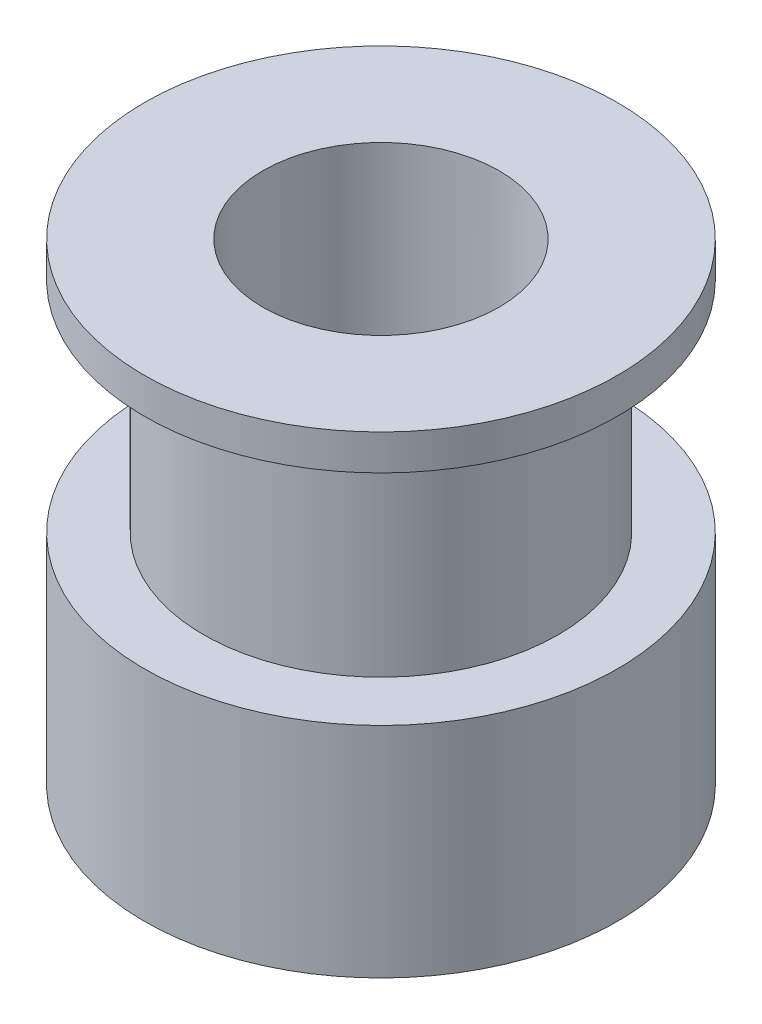
ISO-10303-21;
HEADER;
FILE_DESCRIPTION(('STEP AP214'),'2;1');
FILE_NAME('part.step','',(''),(''),'','','');
FILE_SCHEMA(('AUTOMOTIVE_DESIGN { 1 0 10303 214 1 1 1 1 }'));
ENDSEC;
DATA;
#1=APPLICATION_CONTEXT('core data for automotive mechanical design processes');
#2=APPLICATION_PROTOCOL_DEFINITION('international standard','automotive_design',2000,#1);
#3=PRODUCT_CONTEXT('',#1,'mechanical');
#4=PRODUCT('Part','Part','',(#3));
#5=PRODUCT_RELATED_PRODUCT_CATEGORY('part','',(#4));
#6=PRODUCT_DEFINITION_FORMATION('','',#4);
#7=PRODUCT_DEFINITION_CONTEXT('part definition',#1,'design');
#8=PRODUCT_DEFINITION('design','',#6,#7);
#9=PRODUCT_DEFINITION_SHAPE('','',#8);
#10=(LENGTH_UNIT() NAMED_UNIT(*) SI_UNIT(.MILLI.,.METRE.));
#11=(NAMED_UNIT(*) PLANE_ANGLE_UNIT() SI_UNIT($,.RADIAN.));
#12=(NAMED_UNIT(*) SI_UNIT($,.STERADIAN.) SOLID_ANGLE_UNIT());
#13=UNCERTAINTY_MEASURE_WITH_UNIT(LENGTH_MEASURE(1.E-05),#10,'distance_accuracy_value','');
#14=(GEOMETRIC_REPRESENTATION_CONTEXT(3) GLOBAL_UNCERTAINTY_ASSIGNED_CONTEXT((#13)) GLOBAL_UNIT_ASSIGNED_CONTEXT((#10,
#11,#12)) REPRESENTATION_CONTEXT('',''));
#15=CARTESIAN_POINT('',(0.,0.,0.));
#16=DIRECTION('',(0.,0.,1.));
#17=DIRECTION('',(1.,0.,0.));
#18=AXIS2_PLACEMENT_3D('',#15,#16,#17);
#19=CARTESIAN_POINT('',(0.,-11.,0.));
#20=DIRECTION('',(0.,-1.,0.));
#21=DIRECTION('',(1.,0.,0.));
#22=AXIS2_PLACEMENT_3D('',#19,#20,#21);
#23=PLANE('',#22);
#24=CARTESIAN_POINT('',(0.,-11.,0.));
#25=DIRECTION('',(0.,-1.,0.));
#26=DIRECTION('',(1.,0.,0.));
#27=AXIS2_PLACEMENT_3D('',#24,#25,#26);
#28=CIRCLE('',#27,4.);
#29=CARTESIAN_POINT('',(4.,-11.,0.));
#30=VERTEX_POINT('',#29);
#31=EDGE_CURVE('E69',#30,#30,#28,.F.);
#32=ORIENTED_EDGE('',*,*,#31,.T.);
#33=EDGE_LOOP('',(#32));
#34=FACE_BOUND('',#33,.T.);
#35=CARTESIAN_POINT('',(0.,-10.9999999999999,0.));
#36=DIRECTION('',(0.,1.,0.));
#37=DIRECTION('',(-1.,0.,0.));
#38=AXIS2_PLACEMENT_3D('',#35,#36,#37);
#39=CIRCLE('',#38,8.);
#40=CARTESIAN_POINT('',(-8.,-10.9999999999999,0.));
#41=VERTEX_POINT('',#40);
#42=EDGE_CURVE('E10',#41,#41,#39,.T.);
#43=ORIENTED_EDGE('',*,*,#42,.F.);
#44=EDGE_LOOP('',(#43));
#45=FACE_BOUND('',#44,.T.);
#46=ADVANCED_FACE('F37',(#34,#45),#23,.T.);
#47=CARTESIAN_POINT('',(0.,1004.77636363636,0.));
#48=DIRECTION('',(0.,1.,0.));
#49=DIRECTION('',(-1.,0.,0.));
#50=AXIS2_PLACEMENT_3D('',#47,#48,#49);
#51=CYLINDRICAL_SURFACE('',#50,8.);
#52=CARTESIAN_POINT('',(-7.74596669241484,-7.30000000000005,-1.99999999999997));
#53=CARTESIAN_POINT('',(-7.74596880070288,-7.18955939925879,-1.99999686287443));
#54=CARTESIAN_POINT('',(-7.74835444811678,-7.07908408105723,-1.99082099639809));
#55=CARTESIAN_POINT('',(-7.75761489594052,-6.86130593746124,-1.95441850037101));
#56=CARTESIAN_POINT('',(-7.76449230897305,-6.7540049964255,-1.92718136539366));
#57=CARTESIAN_POINT('',(-7.78190979676921,-6.5457571694503,-1.85559295970561));
#58=CARTESIAN_POINT('',(-7.79244514152367,-6.44480227569148,-1.81126378228357));
#59=CARTESIAN_POINT('',(-7.81598553623007,-6.25175131796814,-1.70681691300908));
#60=CARTESIAN_POINT('',(-7.82899069102792,-6.15965563033588,-1.64669855084852));
#61=CARTESIAN_POINT('',(-7.856325730845,-5.98491068379028,-1.51096674184948));
#62=CARTESIAN_POINT('',(-7.87067678098427,-5.90248511972001,-1.43506951016321));
#63=CARTESIAN_POINT('',(-7.89890300412235,-5.75139088451178,-1.2705456512805));
#64=CARTESIAN_POINT('',(-7.91277813253111,-5.68272349950265,-1.18191783534422));
#65=CARTESIAN_POINT('',(-7.93872332416466,-5.56017962589503,-0.992916160863138));
#66=CARTESIAN_POINT('',(-7.95076549920474,-5.50652288947088,-0.89239566095607));
#67=CARTESIAN_POINT('',(-7.97144649540787,-5.41695228467758,-0.683410547434183));
#68=CARTESIAN_POINT('',(-7.98008581867475,-5.38103579846764,-0.574947108633526));
#69=CARTESIAN_POINT('',(-7.99283807078544,-5.32868173233718,-0.355487007003302));
#70=CARTESIAN_POINT('',(-7.99703915075451,-5.31186428453878,-0.244586175639154));
#71=CARTESIAN_POINT('',(-8.00074875285838,-5.2969932965796,-0.0214630554101889));
#72=CARTESIAN_POINT('',(-8.00025796877363,-5.29893698223237,0.0907590356304813));
#73=CARTESIAN_POINT('',(-7.99470475962827,-5.32125988020016,0.310704494344801));
#74=CARTESIAN_POINT('',(-7.98974401872699,-5.34122906004313,0.41847243120216));
#75=CARTESIAN_POINT('',(-7.97592669219883,-5.39837701603885,0.629076494827399));
#76=CARTESIAN_POINT('',(-7.96706989918752,-5.43555670830197,0.731912358740902));
#77=CARTESIAN_POINT('',(-7.94630007760716,-5.5264020565497,0.930813407003639));
#78=CARTESIAN_POINT('',(-7.93436015756042,-5.58021363572944,1.02680901953303));
#79=CARTESIAN_POINT('',(-7.90871923047719,-5.70268454329305,1.208551244681));
#80=CARTESIAN_POINT('',(-7.89501791721991,-5.77134645484854,1.29429607017104));
#81=CARTESIAN_POINT('',(-7.86690971015616,-5.92376699358595,1.45554807016994));
#82=CARTESIAN_POINT('',(-7.85249375620733,-6.00788391387827,1.53071535815042));
#83=CARTESIAN_POINT('',(-7.82492034813364,-6.18767997883225,1.66595275192606));
#84=CARTESIAN_POINT('',(-7.81176295284776,-6.28335966359285,1.72602215209206));
#85=CARTESIAN_POINT('',(-7.78816397465318,-6.48423202731922,1.82957625804522));
#86=CARTESIAN_POINT('',(-7.77773586980576,-6.5894685842506,1.87297913394101));
#87=CARTESIAN_POINT('',(-7.76094912111965,-6.80606837446121,1.94137124127271));
#88=CARTESIAN_POINT('',(-7.75458960648174,-6.91743029118656,1.96636441310585));
#89=CARTESIAN_POINT('',(-7.74684284831312,-7.13996760121854,1.99666371093217));
#90=CARTESIAN_POINT('',(-7.74532871274918,-7.25107023466375,2.00247237913573));
#91=CARTESIAN_POINT('',(-7.74709874784831,-7.47265754926257,1.99561359241246));
#92=CARTESIAN_POINT('',(-7.75038247681012,-7.58314228636104,1.98294783827907));
#93=CARTESIAN_POINT('',(-7.76125665563648,-7.79849141196381,1.93994037115016));
#94=CARTESIAN_POINT('',(-7.76877576187499,-7.90341818125672,1.90989125462542));
#95=CARTESIAN_POINT('',(-7.78720574616769,-8.10674516628139,1.83329446533652));
#96=CARTESIAN_POINT('',(-7.7981170259889,-8.20514460724432,1.78674483817006));
#97=CARTESIAN_POINT('',(-7.82236909674609,-8.39475302229393,1.67741653434927));
#98=CARTESIAN_POINT('',(-7.83575334885313,-8.48578307203453,1.61433740306853));
#99=CARTESIAN_POINT('',(-7.86333666457372,-8.65615069024113,1.47412058586894));
#100=CARTESIAN_POINT('',(-7.87753586182776,-8.73548633332011,1.39698058961091));
#101=CARTESIAN_POINT('',(-7.90557922425284,-8.88224883405681,1.22852544196948));
#102=CARTESIAN_POINT('',(-7.91940561649468,-8.9493280500391,1.13690390506321));
#103=CARTESIAN_POINT('',(-7.94477773290987,-9.06714869356104,0.943405365389378));
#104=CARTESIAN_POINT('',(-7.95632357603168,-9.11789097328661,0.841528897915209));
#105=CARTESIAN_POINT('',(-7.9757609259065,-9.20115682762239,0.631116403462208));
#106=CARTESIAN_POINT('',(-7.98367864017924,-9.2338114275033,0.522634762055791));
#107=CARTESIAN_POINT('',(-7.99508234716633,-9.28036826768678,0.301499520637641));
#108=CARTESIAN_POINT('',(-7.99856919514738,-9.29427412699128,0.188846730082509));
#109=CARTESIAN_POINT('',(-8.00068338817611,-9.30273517915112,-0.0341670528866179));
#110=CARTESIAN_POINT('',(-7.99943957759977,-9.29780341819086,-0.144507653932015));
#111=CARTESIAN_POINT('',(-7.99251792914887,-9.26990434541135,-0.362734992829473));
#112=CARTESIAN_POINT('',(-7.98684022314338,-9.24693756997371,-0.470621803561829));
#113=CARTESIAN_POINT('',(-7.97170865707778,-9.18389556045832,-0.680342071289521));
#114=CARTESIAN_POINT('',(-7.96227529004785,-9.14391309337129,-0.782204989161699));
#115=CARTESIAN_POINT('',(-7.94062577827316,-9.0480588419609,-0.977834106083221));
#116=CARTESIAN_POINT('',(-7.92840928277515,-8.99218505465908,-1.07159928253124));
#117=CARTESIAN_POINT('',(-7.90214499360574,-8.86456953200778,-1.25080385684658));
#118=CARTESIAN_POINT('',(-7.88806033883329,-8.79247971419239,-1.33598997659664));
#119=CARTESIAN_POINT('',(-7.8598129811438,-8.63515429604535,-1.49323004054698));
#120=CARTESIAN_POINT('',(-7.84565025934605,-8.54991536777772,-1.56528065015315));
#121=CARTESIAN_POINT('',(-7.81854951691005,-8.36679717162113,-1.69552405294364));
#122=CARTESIAN_POINT('',(-7.80563927346578,-8.26871175326954,-1.75343323883273));
#123=CARTESIAN_POINT('',(-7.78287910989656,-8.06388902025041,-1.85185379317091));
#124=CARTESIAN_POINT('',(-7.77302696466428,-7.95715806781236,-1.89237781950428));
#125=CARTESIAN_POINT('',(-7.75903817501475,-7.75884597632973,-1.94884505714198));
#126=CARTESIAN_POINT('',(-7.75417326006998,-7.66821367122777,-1.96798634119373));
#127=CARTESIAN_POINT('',(-7.74763677165241,-7.48506226200467,-1.99356458514351));
#128=CARTESIAN_POINT('',(-7.74596492578216,-7.39254331951124,-2.00000262874347));
#129=CARTESIAN_POINT('',(-7.74596669241484,-7.30000000000005,-1.99999999999997));
#130=B_SPLINE_CURVE_WITH_KNOTS('',3,(#52,#53,#54,#55,#56,#57,#58,#59,#60,#61,#62,#63,#64,#65,
#66,#67,#68,#69,#70,#71,#72,#73,#74,#75,#76,#77,#78,#79,#80,#81,#82,#83,#84,#85,#86,#87,#88,#89,
#90,#91,#92,#93,#94,#95,#96,#97,#98,#99,#100,#101,#102,#103,#104,#105,#106,#107,#108,#109,#110,
#111,#112,#113,#114,#115,#116,#117,#118,#119,#120,#121,#122,#123,#124,#125,#126,#127,#128,#129),
.UNSPECIFIED.,.T.,.F.,(4,2,2,2,2,2,2,2,2,2,2,2,2,2,2,2,2,2,2,2,2,2,2,2,2,2,2,2,2,2,2,2,2,2,2,2,
2,2,4),(0.,0.33098195338891,0.662156593142933,0.992904581732815,1.32366661404383,
1.66099163354381,1.99834817183893,2.34041197118336,2.68242527877674,3.01751000796277,
3.35254518932816,3.68014610151158,4.00776445379829,4.33834299403556,4.66897908375131,
5.00856373257529,5.34816424959842,5.68941145606722,6.03058560103638,6.36274859809374,
6.69488101747042,7.02157924007366,7.34831617137134,7.68146276687326,8.01466415108036,
8.35620264772255,8.69772332575643,9.03673658245543,9.3756843912723,9.70546756901965,
10.0352409390158,10.3632390124777,10.6912784459046,11.0271767726566,11.3631602525241,
11.7054118182895,12.0474137709606,12.3247826174462,12.6021278008238),.UNSPECIFIED.);
#131=CARTESIAN_POINT('',(-7.74596669241484,-7.30000000000005,-1.99999999999997));
#132=VERTEX_POINT('',#131);
#133=EDGE_CURVE('E110',#132,#132,#130,.T.);
#134=ORIENTED_EDGE('',*,*,#133,.T.);
#135=EDGE_LOOP('',(#134));
#136=FACE_BOUND('',#135,.T.);
#137=CARTESIAN_POINT('',(2.,-7.30000000000005,-7.74596669241483));
#138=CARTESIAN_POINT('',(1.99999686287446,-7.18955939925879,-7.74596880070288));
#139=CARTESIAN_POINT('',(1.99082099639812,-7.07908408105723,-7.74835444811678));
#140=CARTESIAN_POINT('',(1.95441850037104,-6.86130593746124,-7.75761489594051));
#141=CARTESIAN_POINT('',(1.92718136539368,-6.7540049964255,-7.76449230897304));
#142=CARTESIAN_POINT('',(1.85559295970563,-6.5457571694503,-7.7819097967692));
#143=CARTESIAN_POINT('',(1.81126378228359,-6.44480227569148,-7.79244514152366));
#144=CARTESIAN_POINT('',(1.70681691300911,-6.25175131796814,-7.81598553623007));
#145=CARTESIAN_POINT('',(1.64669855084855,-6.15965563033587,-7.82899069102791));
#146=CARTESIAN_POINT('',(1.51096674184951,-5.98491068379028,-7.856325730845));
#147=CARTESIAN_POINT('',(1.43506951016324,-5.90248511972001,-7.87067678098427));
#148=CARTESIAN_POINT('',(1.27054565128053,-5.75139088451178,-7.89890300412235));
#149=CARTESIAN_POINT('',(1.18191783534425,-5.68272349950265,-7.9127781325311));
#150=CARTESIAN_POINT('',(0.992916160863165,-5.56017962589503,-7.93872332416466));
#151=CARTESIAN_POINT('',(0.892395660956098,-5.50652288947088,-7.95076549920474));
#152=CARTESIAN_POINT('',(0.683410547434211,-5.41695228467758,-7.97144649540787));
#153=CARTESIAN_POINT('',(0.574947108633553,-5.38103579846764,-7.98008581867475));
#154=CARTESIAN_POINT('',(0.35548700700333,-5.32868173233718,-7.99283807078544));
#155=CARTESIAN_POINT('',(0.244586175639181,-5.31186428453878,-7.99703915075451));
#156=CARTESIAN_POINT('',(0.0214630554102163,-5.2969932965796,-8.00074875285838));
#157=CARTESIAN_POINT('',(-0.0907590356304541,-5.29893698223237,-8.00025796877363));
#158=CARTESIAN_POINT('',(-0.310704494344774,-5.32125988020016,-7.99470475962828));
#159=CARTESIAN_POINT('',(-0.418472431202133,-5.34122906004313,-7.98974401872699));
#160=CARTESIAN_POINT('',(-0.629076494827372,-5.39837701603885,-7.97592669219883));
#161=CARTESIAN_POINT('',(-0.731912358740875,-5.43555670830198,-7.96706989918752));
#162=CARTESIAN_POINT('',(-0.930813407003612,-5.5264020565497,-7.94630007760716));
#163=CARTESIAN_POINT('',(-1.02680901953301,-5.58021363572945,-7.93436015756043));
#164=CARTESIAN_POINT('',(-1.20855124468098,-5.70268454329305,-7.90871923047719));
#165=CARTESIAN_POINT('',(-1.29429607017101,-5.77134645484854,-7.89501791721992));
#166=CARTESIAN_POINT('',(-1.45554807016991,-5.92376699358595,-7.86690971015616));
#167=CARTESIAN_POINT('',(-1.5307153581504,-6.00788391387827,-7.85249375620734));
#168=CARTESIAN_POINT('',(-1.66595275192604,-6.18767997883225,-7.82492034813365));
#169=CARTESIAN_POINT('',(-1.72602215209203,-6.28335966359285,-7.81176295284776));
#170=CARTESIAN_POINT('',(-1.82957625804519,-6.48423202731922,-7.78816397465318));
#171=CARTESIAN_POINT('',(-1.87297913394098,-6.5894685842506,-7.77773586980576));
#172=CARTESIAN_POINT('',(-1.94137124127268,-6.80606837446121,-7.76094912111965));
#173=CARTESIAN_POINT('',(-1.96636441310582,-6.91743029118656,-7.75458960648175));
#174=CARTESIAN_POINT('',(-1.99666371093214,-7.13996760121854,-7.74684284831312));
#175=CARTESIAN_POINT('',(-2.0024723791357,-7.25107023466375,-7.74532871274918));
#176=CARTESIAN_POINT('',(-1.99561359241244,-7.47265754926257,-7.74709874784831));
#177=CARTESIAN_POINT('',(-1.98294783827904,-7.58314228636104,-7.75038247681013));
#178=CARTESIAN_POINT('',(-1.93994037115013,-7.79849141196381,-7.76125665563648));
#179=CARTESIAN_POINT('',(-1.9098912546254,-7.90341818125672,-7.768775761875));
#180=CARTESIAN_POINT('',(-1.8332944653365,-8.10674516628139,-7.7872057461677));
#181=CARTESIAN_POINT('',(-1.78674483817004,-8.20514460724432,-7.7981170259889));
#182=CARTESIAN_POINT('',(-1.67741653434924,-8.39475302229393,-7.8223690967461));
#183=CARTESIAN_POINT('',(-1.6143374030685,-8.48578307203453,-7.83575334885313));
#184=CARTESIAN_POINT('',(-1.47412058586891,-8.65615069024113,-7.86333666457373));
#185=CARTESIAN_POINT('',(-1.39698058961088,-8.73548633332011,-7.87753586182776));
#186=CARTESIAN_POINT('',(-1.22852544196945,-8.88224883405681,-7.90557922425285));
#187=CARTESIAN_POINT('',(-1.13690390506319,-8.9493280500391,-7.91940561649468));
#188=CARTESIAN_POINT('',(-0.94340536538935,-9.06714869356104,-7.94477773290987));
#189=CARTESIAN_POINT('',(-0.841528897915181,-9.11789097328661,-7.95632357603169));
#190=CARTESIAN_POINT('',(-0.63111640346218,-9.20115682762239,-7.9757609259065));
#191=CARTESIAN_POINT('',(-0.522634762055763,-9.2338114275033,-7.98367864017925));
#192=CARTESIAN_POINT('',(-0.301499520637613,-9.28036826768678,-7.99508234716633));
#193=CARTESIAN_POINT('',(-0.188846730082481,-9.29427412699128,-7.99856919514738));
#194=CARTESIAN_POINT('',(0.0341670528866463,-9.30273517915112,-8.00068338817611));
#195=CARTESIAN_POINT('',(0.144507653932043,-9.29780341819086,-7.99943957759977));
#196=CARTESIAN_POINT('',(0.362734992829501,-9.26990434541135,-7.99251792914887));
#197=CARTESIAN_POINT('',(0.470621803561857,-9.24693756997371,-7.98684022314338));
#198=CARTESIAN_POINT('',(0.680342071289548,-9.18389556045832,-7.97170865707778));
#199=CARTESIAN_POINT('',(0.782204989161726,-9.14391309337129,-7.96227529004785));
#200=CARTESIAN_POINT('',(0.977834106083249,-9.0480588419609,-7.94062577827316));
#201=CARTESIAN_POINT('',(1.07159928253127,-8.99218505465908,-7.92840928277515));
#202=CARTESIAN_POINT('',(1.25080385684661,-8.86456953200778,-7.90214499360574));
#203=CARTESIAN_POINT('',(1.33598997659667,-8.79247971419239,-7.88806033883329));
#204=CARTESIAN_POINT('',(1.49323004054701,-8.63515429604535,-7.85981298114379));
#205=CARTESIAN_POINT('',(1.56528065015318,-8.54991536777772,-7.84565025934604));
#206=CARTESIAN_POINT('',(1.69552405294366,-8.36679717162113,-7.81854951691005));
#207=CARTESIAN_POINT('',(1.75343323883276,-8.26871175326954,-7.80563927346577));
#208=CARTESIAN_POINT('',(1.85185379317094,-8.06388902025041,-7.78287910989656));
#209=CARTESIAN_POINT('',(1.8923778195043,-7.95715806781236,-7.77302696466427));
#210=CARTESIAN_POINT('',(1.94884505714201,-7.75884597632973,-7.75903817501474));
#211=CARTESIAN_POINT('',(1.96798634119376,-7.66821367122777,-7.75417326006998));
#212=CARTESIAN_POINT('',(1.99356458514354,-7.48506226200467,-7.7476367716524));
#213=CARTESIAN_POINT('',(2.0000026287435,-7.39254331951124,-7.74596492578215));
#214=CARTESIAN_POINT('',(2.,-7.30000000000005,-7.74596669241483));
#215=B_SPLINE_CURVE_WITH_KNOTS('',3,(#137,#138,#139,#140,#141,#142,#143,#144,#145,#146,#147,
#148,#149,#150,#151,#152,#153,#154,#155,#156,#157,#158,#159,#160,#161,#162,#163,#164,#165,#166,
#167,#168,#169,#170,#171,#172,#173,#174,#175,#176,#177,#178,#179,#180,#181,#182,#183,#184,#185,
#186,#187,#188,#189,#190,#191,#192,#193,#194,#195,#196,#197,#198,#199,#200,#201,#202,#203,#204,
#205,#206,#207,#208,#209,#210,#211,#212,#213,#214),.UNSPECIFIED.,.T.,.F.,(4,2,2,2,2,2,2,2,2,2,2,
2,2,2,2,2,2,2,2,2,2,2,2,2,2,2,2,2,2,2,2,2,2,2,2,2,2,2,4),(0.,0.330981953388909,
0.662156593142933,0.992904581732816,1.32366661404383,1.66099163354381,1.99834817183893,
2.34041197118336,2.68242527877674,3.01751000796277,3.35254518932816,3.68014610151158,
4.00776445379829,4.33834299403556,4.66897908375131,5.00856373257529,5.34816424959841,
5.68941145606722,6.03058560103638,6.36274859809373,6.69488101747041,7.02157924007365,
7.34831617137134,7.68146276687326,8.01466415108036,8.35620264772255,8.69772332575643,
9.03673658245543,9.3756843912723,9.70546756901965,10.0352409390158,10.3632390124777,
10.6912784459046,11.0271767726566,11.3631602525241,11.7054118182895,12.0474137709606,
12.3247826174462,12.6021278008238),.UNSPECIFIED.);
#216=CARTESIAN_POINT('',(2.,-7.30000000000005,-7.74596669241483));
#217=VERTEX_POINT('',#216);
#218=EDGE_CURVE('E77',#217,#217,#215,.T.);
#219=ORIENTED_EDGE('',*,*,#218,.T.);
#220=EDGE_LOOP('',(#219));
#221=FACE_BOUND('',#220,.T.);
#222=ORIENTED_EDGE('',*,*,#42,.T.);
#223=EDGE_LOOP('',(#222));
#224=FACE_BOUND('',#223,.T.);
#225=CARTESIAN_POINT('',(0.,-3.60000000000005,0.));
#226=DIRECTION('',(0.,1.,0.));
#227=DIRECTION('',(-1.,0.,0.));
#228=AXIS2_PLACEMENT_3D('',#225,#226,#227);
#229=CIRCLE('',#228,8.);
#230=CARTESIAN_POINT('',(-8.,-3.60000000000005,0.));
#231=VERTEX_POINT('',#230);
#232=EDGE_CURVE('E44',#231,#231,#229,.T.);
#233=ORIENTED_EDGE('',*,*,#232,.F.);
#234=EDGE_LOOP('',(#233));
#235=FACE_BOUND('',#234,.T.);
#236=ADVANCED_FACE('F151',(#136,#221,#224,#235),#51,.T.);
#237=CARTESIAN_POINT('',(-6.,-3.6,0.));
#238=DIRECTION('',(0.,1.,0.));
#239=DIRECTION('',(-1.,0.,0.));
#240=AXIS2_PLACEMENT_3D('',#237,#238,#239);
#241=PLANE('',#240);
#242=ORIENTED_EDGE('',*,*,#232,.T.);
#243=EDGE_LOOP('',(#242));
#244=FACE_BOUND('',#243,.T.);
#245=CARTESIAN_POINT('',(0.,-3.60000000000005,0.));
#246=DIRECTION('',(0.,1.,0.));
#247=DIRECTION('',(-1.,0.,0.));
#248=AXIS2_PLACEMENT_3D('',#245,#246,#247);
#249=CIRCLE('',#248,6.);
#250=CARTESIAN_POINT('',(-6.,-3.60000000000005,0.));
#251=VERTEX_POINT('',#250);
#252=EDGE_CURVE('E49',#251,#251,#249,.T.);
#253=ORIENTED_EDGE('',*,*,#252,.F.);
#254=EDGE_LOOP('',(#253));
#255=FACE_BOUND('',#254,.T.);
#256=ADVANCED_FACE('F156',(#244,#255),#241,.T.);
#257=CARTESIAN_POINT('',(0.,1004.77636363636,0.));
#258=DIRECTION('',(0.,1.,0.));
#259=DIRECTION('',(-1.,0.,0.));
#260=AXIS2_PLACEMENT_3D('',#257,#258,#259);
#261=CYLINDRICAL_SURFACE('',#260,6.);
#262=ORIENTED_EDGE('',*,*,#252,.T.);
#263=EDGE_LOOP('',(#262));
#264=FACE_BOUND('',#263,.T.);
#265=CARTESIAN_POINT('',(0.,3.80000000000003,0.));
#266=DIRECTION('',(0.,1.,0.));
#267=DIRECTION('',(-1.,0.,0.));
#268=AXIS2_PLACEMENT_3D('',#265,#266,#267);
#269=CIRCLE('',#268,6.);
#270=CARTESIAN_POINT('',(-6.,3.80000000000003,0.));
#271=VERTEX_POINT('',#270);
#272=EDGE_CURVE('E54',#271,#271,#269,.T.);
#273=ORIENTED_EDGE('',*,*,#272,.F.);
#274=EDGE_LOOP('',(#273));
#275=FACE_BOUND('',#274,.T.);
#276=ADVANCED_FACE('F147',(#264,#275),#261,.T.);
#277=CARTESIAN_POINT('',(-6.,3.8,0.));
#278=DIRECTION('',(0.,-1.,0.));
#279=DIRECTION('',(1.,0.,0.));
#280=AXIS2_PLACEMENT_3D('',#277,#278,#279);
#281=PLANE('',#280);
#282=ORIENTED_EDGE('',*,*,#272,.T.);
#283=EDGE_LOOP('',(#282));
#284=FACE_BOUND('',#283,.T.);
#285=CARTESIAN_POINT('',(0.,3.80000000000003,0.));
#286=DIRECTION('',(0.,1.,0.));
#287=DIRECTION('',(-1.,0.,0.));
#288=AXIS2_PLACEMENT_3D('',#285,#286,#287);
#289=CIRCLE('',#288,8.);
#290=CARTESIAN_POINT('',(-8.,3.80000000000003,0.));
#291=VERTEX_POINT('',#290);
#292=EDGE_CURVE('E60',#291,#291,#289,.T.);
#293=ORIENTED_EDGE('',*,*,#292,.F.);
#294=EDGE_LOOP('',(#293));
#295=FACE_BOUND('',#294,.T.);
#296=ADVANCED_FACE('F141',(#284,#295),#281,.T.);
#297=CARTESIAN_POINT('',(0.,1004.77636363636,0.));
#298=DIRECTION('',(0.,1.,0.));
#299=DIRECTION('',(-1.,0.,0.));
#300=AXIS2_PLACEMENT_3D('',#297,#298,#299);
#301=CYLINDRICAL_SURFACE('',#300,8.);
#302=ORIENTED_EDGE('',*,*,#292,.T.);
#303=EDGE_LOOP('',(#302));
#304=FACE_BOUND('',#303,.T.);
#305=CARTESIAN_POINT('',(0.,5.,0.));
#306=DIRECTION('',(0.,1.,0.));
#307=DIRECTION('',(-1.,0.,0.));
#308=AXIS2_PLACEMENT_3D('',#305,#306,#307);
#309=CIRCLE('',#308,8.);
#310=CARTESIAN_POINT('',(-8.,5.,0.));
#311=VERTEX_POINT('',#310);
#312=EDGE_CURVE('E64',#311,#311,#309,.T.);
#313=ORIENTED_EDGE('',*,*,#312,.F.);
#314=EDGE_LOOP('',(#313));
#315=FACE_BOUND('',#314,.T.);
#316=ADVANCED_FACE('F136',(#304,#315),#301,.T.);
#317=CARTESIAN_POINT('',(0.,5.,0.));
#318=DIRECTION('',(0.,1.,0.));
#319=DIRECTION('',(-1.,0.,0.));
#320=AXIS2_PLACEMENT_3D('',#317,#318,#319);
#321=PLANE('',#320);
#322=CARTESIAN_POINT('',(0.,5.,0.));
#323=DIRECTION('',(0.,1.,0.));
#324=DIRECTION('',(-1.,0.,0.));
#325=AXIS2_PLACEMENT_3D('',#322,#323,#324);
#326=CIRCLE('',#325,4.);
#327=CARTESIAN_POINT('',(-4.,5.,0.));
#328=VERTEX_POINT('',#327);
#329=EDGE_CURVE('E68',#328,#328,#326,.T.);
#330=ORIENTED_EDGE('',*,*,#329,.F.);
#331=EDGE_LOOP('',(#330));
#332=FACE_BOUND('',#331,.T.);
#333=ORIENTED_EDGE('',*,*,#312,.T.);
#334=EDGE_LOOP('',(#333));
#335=FACE_BOUND('',#334,.T.);
#336=ADVANCED_FACE('F126',(#332,#335),#321,.T.);
#337=CARTESIAN_POINT('',(0.,-11.0009999999999,0.));
#338=DIRECTION('',(0.,1.,0.));
#339=DIRECTION('',(-1.,0.,0.));
#340=AXIS2_PLACEMENT_3D('',#337,#338,#339);
#341=CYLINDRICAL_SURFACE('',#340,4.);
#342=CARTESIAN_POINT('',(-3.46410161513776,-7.30000000000005,-1.99999999999999));
#343=CARTESIAN_POINT('',(-3.46411185715888,-7.1957867945257,-1.9999915874878));
#344=CARTESIAN_POINT('',(-3.46887633544978,-7.09143782346625,-1.99179963610436));
#345=CARTESIAN_POINT('',(-3.48724701669073,-6.88594482276945,-1.95944672580052));
#346=CARTESIAN_POINT('',(-3.50087179788183,-6.78480799675229,-1.93525221095661));
#347=CARTESIAN_POINT('',(-3.53498701490002,-6.58909684355311,-1.87219981598029));
#348=CARTESIAN_POINT('',(-3.55544089069169,-6.4944907411508,-1.83341988295962));
#349=CARTESIAN_POINT('',(-3.60085327291133,-6.3131515495239,-1.74253507245137));
#350=CARTESIAN_POINT('',(-3.62581202301254,-6.22641888656328,-1.69042947410138));
#351=CARTESIAN_POINT('',(-3.67993738819289,-6.05538855686666,-1.56933307453799));
#352=CARTESIAN_POINT('',(-3.70928127465103,-5.97188173240828,-1.49930407053532));
#353=CARTESIAN_POINT('',(-3.76743965382122,-5.81718321942945,-1.34650761698201));
#354=CARTESIAN_POINT('',(-3.79625387610259,-5.74599767379608,-1.2637338520484));
#355=CARTESIAN_POINT('',(-3.85242953961661,-5.61326569881155,-1.08097912631264));
#356=CARTESIAN_POINT('',(-3.87956212851245,-5.55269246457674,-0.980214377887141));
#357=CARTESIAN_POINT('',(-3.92701512184167,-5.44971829321296,-0.768314053336905));
#358=CARTESIAN_POINT('',(-3.94733982363631,-5.40730588764925,-0.657185076311973));
#359=CARTESIAN_POINT('',(-3.97760922492053,-5.34499067746887,-0.436089887818805));
#360=CARTESIAN_POINT('',(-3.9881896044274,-5.32370094730795,-0.326603580968773));
#361=CARTESIAN_POINT('',(-4.00015167691179,-5.29966776263102,-0.105141257404528));
#362=CARTESIAN_POINT('',(-4.00153893568935,-5.29691308640376,0.00683321168521973));
#363=CARTESIAN_POINT('',(-3.99525963833124,-5.30949334794519,0.219665048849585));
#364=CARTESIAN_POINT('',(-3.98836991784381,-5.32327603104368,0.320642398354151));
#365=CARTESIAN_POINT('',(-3.96748490519435,-5.36576168780817,0.518627543836101));
#366=CARTESIAN_POINT('',(-3.95348908132771,-5.39446577795217,0.615635042187714));
#367=CARTESIAN_POINT('',(-3.91943166575325,-5.46616513218,0.804618783139272));
#368=CARTESIAN_POINT('',(-3.89928883058402,-5.50935262634427,0.89650684703041));
#369=CARTESIAN_POINT('',(-3.8547529197337,-5.60852683240295,1.07195360302663));
#370=CARTESIAN_POINT('',(-3.83035832314967,-5.66451812660472,1.15550929767729));
#371=CARTESIAN_POINT('',(-3.77688788798459,-5.7937907030661,1.32034732179641));
#372=CARTESIAN_POINT('',(-3.7475875199635,-5.86820605665207,1.40066815005874));
#373=CARTESIAN_POINT('',(-3.68908681173622,-6.02917944986039,1.54820874059557));
#374=CARTESIAN_POINT('',(-3.65988656531257,-6.11574674454817,1.61541842314847));
#375=CARTESIAN_POINT('',(-3.60288312184969,-6.30529638484822,1.73901066928444));
#376=CARTESIAN_POINT('',(-3.57528639981415,-6.40897204610847,1.79443462995611));
#377=CARTESIAN_POINT('',(-3.52750900557151,-6.62587534271804,1.88663822600247));
#378=CARTESIAN_POINT('',(-3.50732060092134,-6.73909286603517,1.92343731642179));
#379=CARTESIAN_POINT('',(-3.47889271634068,-6.96242902256563,1.97436042205009));
#380=CARTESIAN_POINT('',(-3.46983311696992,-7.07208223808715,1.99005024423996));
#381=CARTESIAN_POINT('',(-3.46235838723218,-7.29280268303314,2.00303389322286));
#382=CARTESIAN_POINT('',(-3.46393573778623,-7.40386885823964,2.00034071463007));
#383=CARTESIAN_POINT('',(-3.47668673081169,-7.61130783715748,1.97807208668794));
#384=CARTESIAN_POINT('',(-3.48679175013308,-7.70795890221583,1.96037563342494));
#385=CARTESIAN_POINT('',(-3.51388043102682,-7.89673557254204,1.9113925692649));
#386=CARTESIAN_POINT('',(-3.53086632010067,-7.98885970149353,1.88010155724728));
#387=CARTESIAN_POINT('',(-3.57072444159312,-8.17082266180516,1.80329517720974));
#388=CARTESIAN_POINT('',(-3.59383286486125,-8.2603580337061,1.75718812738531));
#389=CARTESIAN_POINT('',(-3.64312238994499,-8.43093854307909,1.65257412803177));
#390=CARTESIAN_POINT('',(-3.66930506710297,-8.51197928703056,1.594060808665));
#391=CARTESIAN_POINT('',(-3.72575996912668,-8.6739575350427,1.4576743343971));
#392=CARTESIAN_POINT('',(-3.75613166308566,-8.75359430141783,1.37829054462749));
#393=CARTESIAN_POINT('',(-3.81468469955797,-8.89882447600478,1.20680899079905));
#394=CARTESIAN_POINT('',(-3.84286530015463,-8.96441314052689,1.11470694931992));
#395=CARTESIAN_POINT('',(-3.89482723381867,-9.08114745183276,0.91707072510807));
#396=CARTESIAN_POINT('',(-3.91847283343884,-9.13186623616682,0.811246195112505));
#397=CARTESIAN_POINT('',(-3.95766709918776,-9.21427580796966,0.591044729317876));
#398=CARTESIAN_POINT('',(-3.97322287353397,-9.24598330368415,0.476675402917664));
#399=CARTESIAN_POINT('',(-3.99335016363174,-9.28673712748519,0.253959364539777));
#400=CARTESIAN_POINT('',(-3.9987985581427,-9.29759574866432,0.146022887268314));
#401=CARTESIAN_POINT('',(-4.00084260752374,-9.30168653399572,-0.0702519714699321));
#402=CARTESIAN_POINT('',(-3.99744136141634,-9.29492486852891,-0.178590198981601));
#403=CARTESIAN_POINT('',(-3.98267937668509,-9.26516717568364,-0.385075986136846));
#404=CARTESIAN_POINT('',(-3.97185789309443,-9.243270262691,-0.483424641057406));
#405=CARTESIAN_POINT('',(-3.94384187353388,-9.18534604019338,-0.674891898931552));
#406=CARTESIAN_POINT('',(-3.92664642364424,-9.14931670429313,-0.768009749669759));
#407=CARTESIAN_POINT('',(-3.88651861393181,-9.06254574500864,-0.950846833596728));
#408=CARTESIAN_POINT('',(-3.86337234005404,-9.01124078024819,-1.04025036572289));
#409=CARTESIAN_POINT('',(-3.81376266676027,-8.89608471188195,-1.20954920326827));
#410=CARTESIAN_POINT('',(-3.78729774583428,-8.83222784589848,-1.28944011444317));
#411=CARTESIAN_POINT('',(-3.73057218840582,-8.68640336444063,-1.44582833859494));
#412=CARTESIAN_POINT('',(-3.70019591726076,-8.60326581919976,-1.52119665879198));
#413=CARTESIAN_POINT('',(-3.64126158628572,-8.42510777169396,-1.65732528394005));
#414=CARTESIAN_POINT('',(-3.61270515130785,-8.33007686863953,-1.71807266521243));
#415=CARTESIAN_POINT('',(-3.55999186256752,-8.1266911058698,-1.8248671471681));
#416=CARTESIAN_POINT('',(-3.53600256268536,-8.01801008926477,-1.87038902381913));
#417=CARTESIAN_POINT('',(-3.5069621813237,-7.8494218803691,-1.92395929504799));
#418=CARTESIAN_POINT('',(-3.49844389329401,-7.79235217940937,-1.93935666147966));
#419=CARTESIAN_POINT('',(-3.48406059323536,-7.67676744249986,-1.96508069805042));
#420=CARTESIAN_POINT('',(-3.47819372636051,-7.6182534472458,-1.97541091343281));
#421=CARTESIAN_POINT('',(-3.47059023668758,-7.51639921075276,-1.98872932961219));
#422=CARTESIAN_POINT('',(-3.46816389731816,-7.47326694274997,-1.99295091983785));
#423=CARTESIAN_POINT('',(-3.46491740045178,-7.38676430690715,-1.99858810035605));
#424=CARTESIAN_POINT('',(-3.46409735040492,-7.34339392333335,-2.0000035029333));
#425=CARTESIAN_POINT('',(-3.46410161513776,-7.30000000000005,-1.99999999999999));
#426=B_SPLINE_CURVE_WITH_KNOTS('',3,(#342,#343,#344,#345,#346,#347,#348,#349,#350,#351,#352,
#353,#354,#355,#356,#357,#358,#359,#360,#361,#362,#363,#364,#365,#366,#367,#368,#369,#370,#371,
#372,#373,#374,#375,#376,#377,#378,#379,#380,#381,#382,#383,#384,#385,#386,#387,#388,#389,#390,
#391,#392,#393,#394,#395,#396,#397,#398,#399,#400,#401,#402,#403,#404,#405,#406,#407,#408,#409,
#410,#411,#412,#413,#414,#415,#416,#417,#418,#419,#420,#421,#422,#423,#424,#425),.UNSPECIFIED.,
.T.,.F.,(4,2,2,2,2,2,2,2,2,2,2,2,2,2,2,2,2,2,2,2,2,2,2,2,2,2,2,2,2,2,2,2,2,2,2,2,2,2,2,2,2,4),
(0.,0.312464245189431,0.62558578564961,0.937057191861535,1.24854545093096,1.58572462503713,
1.92307142172809,2.28315784481593,2.64301653931849,2.97726969939937,3.31132047376147,
3.61632194973143,3.92134625038977,4.2305906946636,4.5399459870461,4.87854382917848,
5.21740096495904,5.57777683462963,5.93777548427476,6.2692458171249,6.60048186380813,
6.89548366852118,7.19058104876193,7.49934592816242,7.80826972444162,8.15613487165293,
8.50411729960471,8.86128362829998,9.2181355962161,9.5422454078304,9.8662417359201,
10.1688884974705,10.4715786702809,10.7872150144301,11.1029966020551,11.450204837042,
11.7977188569438,12.1562149808128,12.3351395323571,12.5139387197526,12.6440387634036,
12.7741475095882),.UNSPECIFIED.);
#427=CARTESIAN_POINT('',(-3.46410161513776,-7.30000000000005,-1.99999999999999));
#428=VERTEX_POINT('',#427);
#429=EDGE_CURVE('E86',#428,#428,#426,.T.);
#430=ORIENTED_EDGE('',*,*,#429,.F.);
#431=EDGE_LOOP('',(#430));
#432=FACE_BOUND('',#431,.T.);
#433=CARTESIAN_POINT('',(2.,-7.30000000000005,-3.46410161513775));
#434=CARTESIAN_POINT('',(1.99999158748781,-7.1957867945257,-3.46411185715887));
#435=CARTESIAN_POINT('',(1.99179963610437,-7.09143782346625,-3.46887633544978));
#436=CARTESIAN_POINT('',(1.95944672580053,-6.88594482276945,-3.48724701669072));
#437=CARTESIAN_POINT('',(1.93525221095662,-6.78480799675229,-3.50087179788183));
#438=CARTESIAN_POINT('',(1.8721998159803,-6.58909684355311,-3.53498701490001));
#439=CARTESIAN_POINT('',(1.83341988295964,-6.4944907411508,-3.55544089069169));
#440=CARTESIAN_POINT('',(1.74253507245138,-6.31315154952389,-3.60085327291133));
#441=CARTESIAN_POINT('',(1.69042947410139,-6.22641888656327,-3.62581202301253));
#442=CARTESIAN_POINT('',(1.569333074538,-6.05538855686666,-3.67993738819289));
#443=CARTESIAN_POINT('',(1.49930407053533,-5.97188173240828,-3.70928127465103));
#444=CARTESIAN_POINT('',(1.34650761698202,-5.81718321942945,-3.76743965382121));
#445=CARTESIAN_POINT('',(1.26373385204841,-5.74599767379608,-3.79625387610258));
#446=CARTESIAN_POINT('',(1.08097912631265,-5.61326569881155,-3.85242953961661));
#447=CARTESIAN_POINT('',(0.980214377887154,-5.55269246457674,-3.87956212851245));
#448=CARTESIAN_POINT('',(0.768314053336918,-5.44971829321296,-3.92701512184167));
#449=CARTESIAN_POINT('',(0.657185076311987,-5.40730588764925,-3.94733982363631));
#450=CARTESIAN_POINT('',(0.436089887818819,-5.34499067746887,-3.97760922492053));
#451=CARTESIAN_POINT('',(0.326603580968787,-5.32370094730795,-3.98818960442739));
#452=CARTESIAN_POINT('',(0.105141257404542,-5.29966776263102,-4.00015167691179));
#453=CARTESIAN_POINT('',(-0.00683321168520605,-5.29691308640376,-4.00153893568935));
#454=CARTESIAN_POINT('',(-0.219665048849571,-5.30949334794519,-3.99525963833124));
#455=CARTESIAN_POINT('',(-0.320642398354137,-5.32327603104368,-3.98836991784381));
#456=CARTESIAN_POINT('',(-0.518627543836087,-5.36576168780817,-3.96748490519435));
#457=CARTESIAN_POINT('',(-0.6156350421877,-5.39446577795217,-3.95348908132771));
#458=CARTESIAN_POINT('',(-0.804618783139258,-5.46616513218,-3.91943166575325));
#459=CARTESIAN_POINT('',(-0.896506847030397,-5.50935262634427,-3.89928883058403));
#460=CARTESIAN_POINT('',(-1.07195360302662,-5.60852683240295,-3.8547529197337));
#461=CARTESIAN_POINT('',(-1.15550929767728,-5.66451812660472,-3.83035832314967));
#462=CARTESIAN_POINT('',(-1.3203473217964,-5.7937907030661,-3.7768878879846));
#463=CARTESIAN_POINT('',(-1.40066815005872,-5.86820605665207,-3.7475875199635));
#464=CARTESIAN_POINT('',(-1.54820874059556,-6.02917944986039,-3.68908681173623));
#465=CARTESIAN_POINT('',(-1.61541842314846,-6.11574674454817,-3.65988656531257));
#466=CARTESIAN_POINT('',(-1.73901066928442,-6.30529638484822,-3.60288312184969));
#467=CARTESIAN_POINT('',(-1.7944346299561,-6.40897204610847,-3.57528639981415));
#468=CARTESIAN_POINT('',(-1.88663822600246,-6.62587534271804,-3.52750900557152));
#469=CARTESIAN_POINT('',(-1.92343731642178,-6.73909286603517,-3.50732060092135));
#470=CARTESIAN_POINT('',(-1.97436042205008,-6.96242902256563,-3.47889271634069));
#471=CARTESIAN_POINT('',(-1.99005024423995,-7.07208223808714,-3.46983311696993));
#472=CARTESIAN_POINT('',(-2.00303389322285,-7.29280268303314,-3.46235838723219));
#473=CARTESIAN_POINT('',(-2.00034071463005,-7.40386885823964,-3.46393573778623));
#474=CARTESIAN_POINT('',(-1.97807208668793,-7.61130783715748,-3.4766867308117));
#475=CARTESIAN_POINT('',(-1.96037563342492,-7.70795890221583,-3.48679175013308));
#476=CARTESIAN_POINT('',(-1.91139256926489,-7.89673557254203,-3.51388043102682));
#477=CARTESIAN_POINT('',(-1.88010155724727,-7.98885970149353,-3.53086632010068));
#478=CARTESIAN_POINT('',(-1.80329517720973,-8.17082266180516,-3.57072444159313));
#479=CARTESIAN_POINT('',(-1.7571881273853,-8.2603580337061,-3.59383286486126));
#480=CARTESIAN_POINT('',(-1.65257412803176,-8.43093854307909,-3.643122389945));
#481=CARTESIAN_POINT('',(-1.59406080866498,-8.51197928703056,-3.66930506710298));
#482=CARTESIAN_POINT('',(-1.45767433439708,-8.6739575350427,-3.72575996912669));
#483=CARTESIAN_POINT('',(-1.37829054462747,-8.75359430141783,-3.75613166308566));
#484=CARTESIAN_POINT('',(-1.20680899079904,-8.89882447600478,-3.81468469955797));
#485=CARTESIAN_POINT('',(-1.11470694931991,-8.96441314052689,-3.84286530015463));
#486=CARTESIAN_POINT('',(-0.917070725108059,-9.08114745183276,-3.89482723381867));
#487=CARTESIAN_POINT('',(-0.811246195112494,-9.13186623616681,-3.91847283343884));
#488=CARTESIAN_POINT('',(-0.591044729317865,-9.21427580796966,-3.95766709918776));
#489=CARTESIAN_POINT('',(-0.476675402917652,-9.24598330368415,-3.97322287353397));
#490=CARTESIAN_POINT('',(-0.253959364539764,-9.28673712748519,-3.99335016363174));
#491=CARTESIAN_POINT('',(-0.146022887268301,-9.29759574866432,-3.9987985581427));
#492=CARTESIAN_POINT('',(0.0702519714699451,-9.30168653399572,-4.00084260752374));
#493=CARTESIAN_POINT('',(0.178590198981614,-9.29492486852891,-3.99744136141634));
#494=CARTESIAN_POINT('',(0.385075986136859,-9.26516717568364,-3.98267937668509));
#495=CARTESIAN_POINT('',(0.483424641057419,-9.243270262691,-3.97185789309443));
#496=CARTESIAN_POINT('',(0.674891898931565,-9.18534604019338,-3.94384187353387));
#497=CARTESIAN_POINT('',(0.768009749669772,-9.14931670429314,-3.92664642364424));
#498=CARTESIAN_POINT('',(0.950846833596741,-9.06254574500865,-3.8865186139318));
#499=CARTESIAN_POINT('',(1.0402503657229,-9.01124078024819,-3.86337234005404));
#500=CARTESIAN_POINT('',(1.20954920326828,-8.89608471188195,-3.81376266676027));
#501=CARTESIAN_POINT('',(1.28944011444319,-8.83222784589848,-3.78729774583428));
#502=CARTESIAN_POINT('',(1.44582833859495,-8.68640336444063,-3.73057218840582));
#503=CARTESIAN_POINT('',(1.52119665879199,-8.60326581919976,-3.70019591726075));
#504=CARTESIAN_POINT('',(1.65732528394006,-8.42510777169396,-3.64126158628571));
#505=CARTESIAN_POINT('',(1.71807266521244,-8.33007686863953,-3.61270515130784));
#506=CARTESIAN_POINT('',(1.82486714716811,-8.1266911058698,-3.55999186256751));
#507=CARTESIAN_POINT('',(1.87038902381914,-8.01801008926478,-3.53600256268535));
#508=CARTESIAN_POINT('',(1.92395929504801,-7.8494218803691,-3.5069621813237));
#509=CARTESIAN_POINT('',(1.93935666147967,-7.79235217940937,-3.49844389329401));
#510=CARTESIAN_POINT('',(1.96508069805043,-7.67676744249986,-3.48406059323535));
#511=CARTESIAN_POINT('',(1.97541091343283,-7.6182534472458,-3.4781937263605));
#512=CARTESIAN_POINT('',(1.9887293296122,-7.51639921075276,-3.47059023668758));
#513=CARTESIAN_POINT('',(1.99295091983786,-7.47326694274998,-3.46816389731816));
#514=CARTESIAN_POINT('',(1.99858810035606,-7.38676430690715,-3.46491740045177));
#515=CARTESIAN_POINT('',(2.00000350293331,-7.34339392333335,-3.46409735040492));
#516=CARTESIAN_POINT('',(2.,-7.30000000000005,-3.46410161513775));
#517=B_SPLINE_CURVE_WITH_KNOTS('',3,(#433,#434,#435,#436,#437,#438,#439,#440,#441,#442,#443,
#444,#445,#446,#447,#448,#449,#450,#451,#452,#453,#454,#455,#456,#457,#458,#459,#460,#461,#462,
#463,#464,#465,#466,#467,#468,#469,#470,#471,#472,#473,#474,#475,#476,#477,#478,#479,#480,#481,
#482,#483,#484,#485,#486,#487,#488,#489,#490,#491,#492,#493,#494,#495,#496,#497,#498,#499,#500,
#501,#502,#503,#504,#505,#506,#507,#508,#509,#510,#511,#512,#513,#514,#515,#516),.UNSPECIFIED.,
.T.,.F.,(4,2,2,2,2,2,2,2,2,2,2,2,2,2,2,2,2,2,2,2,2,2,2,2,2,2,2,2,2,2,2,2,2,2,2,2,2,2,2,2,2,4),
(0.,0.312464245189431,0.62558578564961,0.937057191861537,1.24854545093097,1.58572462503713,
1.92307142172809,2.28315784481594,2.64301653931849,2.97726969939937,3.31132047376147,
3.61632194973143,3.92134625038977,4.2305906946636,4.5399459870461,4.87854382917848,
5.21740096495904,5.57777683462963,5.93777548427476,6.2692458171249,6.60048186380813,
6.89548366852117,7.19058104876193,7.49934592816242,7.80826972444161,8.15613487165293,
8.50411729960471,8.86128362829998,9.2181355962161,9.5422454078304,9.8662417359201,
10.1688884974705,10.4715786702809,10.7872150144301,11.102996602055,11.450204837042,
11.7977188569437,12.1562149808128,12.3351395323571,12.5139387197526,12.6440387634036,
12.7741475095882),.UNSPECIFIED.);
#518=CARTESIAN_POINT('',(2.,-7.30000000000005,-3.46410161513775));
#519=VERTEX_POINT('',#518);
#520=EDGE_CURVE('E73',#519,#519,#517,.T.);
#521=ORIENTED_EDGE('',*,*,#520,.F.);
#522=EDGE_LOOP('',(#521));
#523=FACE_BOUND('',#522,.T.);
#524=ORIENTED_EDGE('',*,*,#31,.F.);
#525=EDGE_LOOP('',(#524));
#526=FACE_BOUND('',#525,.T.);
#527=ORIENTED_EDGE('',*,*,#329,.T.);
#528=EDGE_LOOP('',(#527));
#529=FACE_BOUND('',#528,.T.);
#530=ADVANCED_FACE('F123',(#432,#523,#526,#529),#341,.F.);
#531=CARTESIAN_POINT('',(0.,-7.30000000000005,-8.001));
#532=DIRECTION('',(0.,0.,1.));
#533=DIRECTION('',(1.,0.,0.));
#534=AXIS2_PLACEMENT_3D('',#531,#532,#533);
#535=CYLINDRICAL_SURFACE('',#534,2.);
#536=ORIENTED_EDGE('',*,*,#218,.F.);
#537=EDGE_LOOP('',(#536));
#538=FACE_BOUND('',#537,.T.);
#539=ORIENTED_EDGE('',*,*,#520,.T.);
#540=EDGE_LOOP('',(#539));
#541=FACE_BOUND('',#540,.T.);
#542=ADVANCED_FACE('F92',(#538,#541),#535,.F.);
#543=CARTESIAN_POINT('',(-8.00100000000003,-7.30000000000005,0.));
#544=DIRECTION('',(1.,0.,0.));
#545=DIRECTION('',(0.,0.,-1.));
#546=AXIS2_PLACEMENT_3D('',#543,#544,#545);
#547=CYLINDRICAL_SURFACE('',#546,2.);
#548=ORIENTED_EDGE('',*,*,#133,.F.);
#549=EDGE_LOOP('',(#548));
#550=FACE_BOUND('',#549,.T.);
#551=ORIENTED_EDGE('',*,*,#429,.T.);
#552=EDGE_LOOP('',(#551));
#553=FACE_BOUND('',#552,.T.);
#554=ADVANCED_FACE('F98',(#550,#553),#547,.F.);
#555=CLOSED_SHELL('',(#46,#236,#256,#276,#296,#316,#336,#530,#542,#554));
#556=MANIFOLD_SOLID_BREP('B2',#555);
#557=ADVANCED_BREP_SHAPE_REPRESENTATION('',(#18,#556),#14);
#558=SHAPE_DEFINITION_REPRESENTATION(#9,#557);
ENDSEC;
END-ISO-10303-21;
